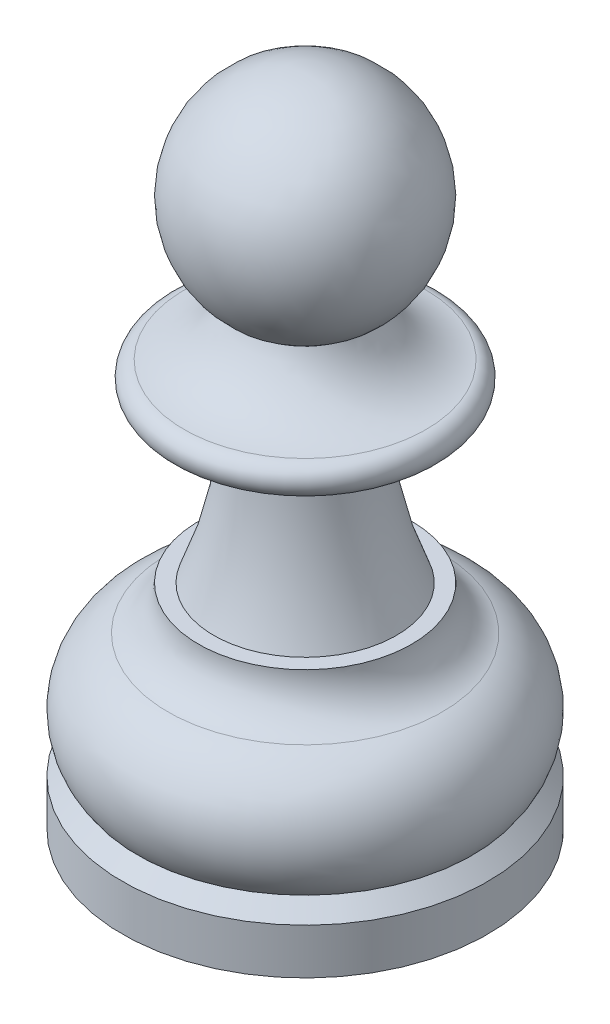
ISO-10303-21;
HEADER;
FILE_DESCRIPTION(('STEP AP214'),'2;1');
FILE_NAME('part.step','',(''),(''),'','','');
FILE_SCHEMA(('AUTOMOTIVE_DESIGN { 1 0 10303 214 1 1 1 1 }'));
ENDSEC;
DATA;
#1=APPLICATION_CONTEXT('core data for automotive mechanical design processes');
#2=APPLICATION_PROTOCOL_DEFINITION('international standard','automotive_design',2000,#1);
#3=PRODUCT_CONTEXT('',#1,'mechanical');
#4=PRODUCT('Part','Part','',(#3));
#5=PRODUCT_RELATED_PRODUCT_CATEGORY('part','',(#4));
#6=PRODUCT_DEFINITION_FORMATION('','',#4);
#7=PRODUCT_DEFINITION_CONTEXT('part definition',#1,'design');
#8=PRODUCT_DEFINITION('design','',#6,#7);
#9=PRODUCT_DEFINITION_SHAPE('','',#8);
#10=(LENGTH_UNIT() NAMED_UNIT(*) SI_UNIT(.MILLI.,.METRE.));
#11=(NAMED_UNIT(*) PLANE_ANGLE_UNIT() SI_UNIT($,.RADIAN.));
#12=(NAMED_UNIT(*) SI_UNIT($,.STERADIAN.) SOLID_ANGLE_UNIT());
#13=UNCERTAINTY_MEASURE_WITH_UNIT(LENGTH_MEASURE(1.E-05),#10,'distance_accuracy_value','');
#14=(GEOMETRIC_REPRESENTATION_CONTEXT(3) GLOBAL_UNCERTAINTY_ASSIGNED_CONTEXT((#13)) GLOBAL_UNIT_ASSIGNED_CONTEXT((#10,
#11,#12)) REPRESENTATION_CONTEXT('',''));
#15=CARTESIAN_POINT('',(0.,0.,0.));
#16=DIRECTION('',(0.,0.,1.));
#17=DIRECTION('',(1.,0.,0.));
#18=AXIS2_PLACEMENT_3D('',#15,#16,#17);
#19=CARTESIAN_POINT('',(0.,0.,0.));
#20=DIRECTION('',(0.,-1.,0.));
#21=DIRECTION('',(0.,0.,-1.));
#22=AXIS2_PLACEMENT_3D('',#19,#20,#21);
#23=PLANE('',#22);
#24=CARTESIAN_POINT('',(0.,0.,0.));
#25=DIRECTION('',(0.,-1.,0.));
#26=DIRECTION('',(0.,0.,-1.));
#27=AXIS2_PLACEMENT_3D('',#24,#25,#26);
#28=CIRCLE('',#27,12.);
#29=CARTESIAN_POINT('',(0.,0.,-12.));
#30=VERTEX_POINT('',#29);
#31=EDGE_CURVE('E10',#30,#30,#28,.T.);
#32=ORIENTED_EDGE('',*,*,#31,.T.);
#33=EDGE_LOOP('',(#32));
#34=FACE_BOUND('',#33,.T.);
#35=ADVANCED_FACE('F31',(#34),#23,.T.);
#36=CARTESIAN_POINT('',(0.,0.,0.));
#37=DIRECTION('',(0.,-1.,0.));
#38=DIRECTION('',(0.,0.,-1.));
#39=AXIS2_PLACEMENT_3D('',#36,#37,#38);
#40=CYLINDRICAL_SURFACE('',#39,12.);
#41=CARTESIAN_POINT('',(0.,3.,0.));
#42=DIRECTION('',(0.,-1.,0.));
#43=DIRECTION('',(0.,0.,-1.));
#44=AXIS2_PLACEMENT_3D('',#41,#42,#43);
#45=CIRCLE('',#44,12.);
#46=CARTESIAN_POINT('',(0.,3.,-12.));
#47=VERTEX_POINT('',#46);
#48=EDGE_CURVE('E37',#47,#47,#45,.T.);
#49=ORIENTED_EDGE('',*,*,#48,.T.);
#50=EDGE_LOOP('',(#49));
#51=FACE_BOUND('',#50,.T.);
#52=ORIENTED_EDGE('',*,*,#31,.F.);
#53=EDGE_LOOP('',(#52));
#54=FACE_BOUND('',#53,.T.);
#55=ADVANCED_FACE('F81',(#51,#54),#40,.T.);
#56=CARTESIAN_POINT('',(0.,3.,0.));
#57=DIRECTION('',(0.,-1.,0.));
#58=DIRECTION('',(0.,0.,-1.));
#59=AXIS2_PLACEMENT_3D('',#56,#57,#58);
#60=CONICAL_SURFACE('',#59,12.,0.785398163397456);
#61=CARTESIAN_POINT('',(0.,3.99999999999999,0.));
#62=DIRECTION('',(0.,-1.,0.));
#63=DIRECTION('',(0.,0.,-1.));
#64=AXIS2_PLACEMENT_3D('',#61,#62,#63);
#65=CIRCLE('',#64,11.);
#66=CARTESIAN_POINT('',(0.,3.99999999999999,-11.));
#67=VERTEX_POINT('',#66);
#68=EDGE_CURVE('E41',#67,#67,#65,.T.);
#69=ORIENTED_EDGE('',*,*,#68,.T.);
#70=EDGE_LOOP('',(#69));
#71=FACE_BOUND('',#70,.T.);
#72=ORIENTED_EDGE('',*,*,#48,.F.);
#73=EDGE_LOOP('',(#72));
#74=FACE_BOUND('',#73,.T.);
#75=ADVANCED_FACE('F85',(#71,#74),#60,.T.);
#76=CARTESIAN_POINT('',(0.,6.85164477067986,0.));
#77=DIRECTION('',(0.,-1.,0.));
#78=DIRECTION('',(0.,0.,-1.));
#79=AXIS2_PLACEMENT_3D('',#76,#77,#78);
#80=TOROIDAL_SURFACE('',#79,7.43406105092708,4.56593894907292);
#81=CARTESIAN_POINT('',(0.,11.1406579082719,0.));
#82=DIRECTION('',(0.,-1.,0.));
#83=DIRECTION('',(0.,0.,-1.));
#84=AXIS2_PLACEMENT_3D('',#81,#82,#83);
#85=CIRCLE('',#84,9.);
#86=CARTESIAN_POINT('',(0.,11.1406579082719,-9.));
#87=VERTEX_POINT('',#86);
#88=EDGE_CURVE('E45',#87,#87,#85,.T.);
#89=ORIENTED_EDGE('',*,*,#88,.T.);
#90=EDGE_LOOP('',(#89));
#91=FACE_BOUND('',#90,.T.);
#92=ORIENTED_EDGE('',*,*,#68,.F.);
#93=EDGE_LOOP('',(#92));
#94=FACE_BOUND('',#93,.T.);
#95=ADVANCED_FACE('F89',(#91,#94),#80,.T.);
#96=CARTESIAN_POINT('',(0.,14.,0.));
#97=DIRECTION('',(0.,-1.,0.));
#98=DIRECTION('',(0.,0.,-1.));
#99=AXIS2_PLACEMENT_3D('',#96,#97,#98);
#100=TOROIDAL_SURFACE('',#99,10.0439592993819,3.04395929938194);
#101=CARTESIAN_POINT('',(0.,14.,0.));
#102=DIRECTION('',(0.,-1.,0.));
#103=DIRECTION('',(0.,0.,-1.));
#104=AXIS2_PLACEMENT_3D('',#101,#102,#103);
#105=CIRCLE('',#104,7.);
#106=CARTESIAN_POINT('',(0.,14.,-7.));
#107=VERTEX_POINT('',#106);
#108=EDGE_CURVE('E50',#107,#107,#105,.T.);
#109=ORIENTED_EDGE('',*,*,#108,.T.);
#110=EDGE_LOOP('',(#109));
#111=FACE_BOUND('',#110,.T.);
#112=ORIENTED_EDGE('',*,*,#88,.F.);
#113=EDGE_LOOP('',(#112));
#114=FACE_BOUND('',#113,.T.);
#115=ADVANCED_FACE('F96',(#111,#114),#100,.F.);
#116=CARTESIAN_POINT('',(6.,14.,0.));
#117=DIRECTION('',(0.,1.,0.));
#118=DIRECTION('',(0.,0.,1.));
#119=AXIS2_PLACEMENT_3D('',#116,#117,#118);
#120=PLANE('',#119);
#121=CARTESIAN_POINT('',(0.,14.,0.));
#122=DIRECTION('',(0.,-1.,0.));
#123=DIRECTION('',(0.,0.,-1.));
#124=AXIS2_PLACEMENT_3D('',#121,#122,#123);
#125=CIRCLE('',#124,5.99999999999999);
#126=CARTESIAN_POINT('',(0.,14.,-5.99999999999999));
#127=VERTEX_POINT('',#126);
#128=EDGE_CURVE('E53',#127,#127,#125,.T.);
#129=ORIENTED_EDGE('',*,*,#128,.T.);
#130=EDGE_LOOP('',(#129));
#131=FACE_BOUND('',#130,.T.);
#132=ORIENTED_EDGE('',*,*,#108,.F.);
#133=EDGE_LOOP('',(#132));
#134=FACE_BOUND('',#133,.T.);
#135=ADVANCED_FACE('F100',(#131,#134),#120,.T.);
#136=CARTESIAN_POINT('',(0.,24.,0.));
#137=DIRECTION('',(0.,-1.,0.));
#138=DIRECTION('',(0.,0.,-1.));
#139=AXIS2_PLACEMENT_3D('',#136,#137,#138);
#140=TOROIDAL_SURFACE('',#139,30.,26.);
#141=CARTESIAN_POINT('',(0.,24.,0.));
#142=DIRECTION('',(0.,-1.,0.));
#143=DIRECTION('',(0.,0.,-1.));
#144=AXIS2_PLACEMENT_3D('',#141,#142,#143);
#145=CIRCLE('',#144,4.);
#146=CARTESIAN_POINT('',(0.,24.,-4.));
#147=VERTEX_POINT('',#146);
#148=EDGE_CURVE('E56',#147,#147,#145,.T.);
#149=ORIENTED_EDGE('',*,*,#148,.T.);
#150=EDGE_LOOP('',(#149));
#151=FACE_BOUND('',#150,.T.);
#152=ORIENTED_EDGE('',*,*,#128,.F.);
#153=EDGE_LOOP('',(#152));
#154=FACE_BOUND('',#153,.T.);
#155=ADVANCED_FACE('F104',(#151,#154),#140,.F.);
#156=CARTESIAN_POINT('',(0.,24.,0.));
#157=DIRECTION('',(0.,1.,0.));
#158=DIRECTION('',(0.,0.,1.));
#159=AXIS2_PLACEMENT_3D('',#156,#157,#158);
#160=CONICAL_SURFACE('',#159,4.,1.39626340159547);
#161=CARTESIAN_POINT('',(0.,24.7053079228338,0.));
#162=DIRECTION('',(0.,-1.,0.));
#163=DIRECTION('',(0.,0.,-1.));
#164=AXIS2_PLACEMENT_3D('',#161,#162,#163);
#165=CIRCLE('',#164,8.);
#166=CARTESIAN_POINT('',(0.,24.7053079228338,-8.));
#167=VERTEX_POINT('',#166);
#168=EDGE_CURVE('E59',#167,#167,#165,.T.);
#169=ORIENTED_EDGE('',*,*,#168,.T.);
#170=EDGE_LOOP('',(#169));
#171=FACE_BOUND('',#170,.T.);
#172=ORIENTED_EDGE('',*,*,#148,.F.);
#173=EDGE_LOOP('',(#172));
#174=FACE_BOUND('',#173,.T.);
#175=ADVANCED_FACE('F108',(#171,#174),#160,.T.);
#176=CARTESIAN_POINT('',(0.,25.690115675846,0.));
#177=DIRECTION('',(0.,-1.,0.));
#178=DIRECTION('',(0.,0.,-1.));
#179=AXIS2_PLACEMENT_3D('',#176,#177,#178);
#180=TOROIDAL_SURFACE('',#179,7.82635182233308,1.);
#181=CARTESIAN_POINT('',(0.,26.6832031350185,0.));
#182=DIRECTION('',(0.,-1.,0.));
#183=DIRECTION('',(0.,0.,-1.));
#184=AXIS2_PLACEMENT_3D('',#181,#182,#183);
#185=CIRCLE('',#184,7.94372855952706);
#186=CARTESIAN_POINT('',(0.,26.6832031350185,-7.94372855952706));
#187=VERTEX_POINT('',#186);
#188=EDGE_CURVE('E62',#187,#187,#185,.T.);
#189=ORIENTED_EDGE('',*,*,#188,.T.);
#190=EDGE_LOOP('',(#189));
#191=FACE_BOUND('',#190,.T.);
#192=ORIENTED_EDGE('',*,*,#168,.F.);
#193=EDGE_LOOP('',(#192));
#194=FACE_BOUND('',#193,.T.);
#195=ADVANCED_FACE('F78',(#191,#194),#180,.T.);
#196=CARTESIAN_POINT('',(0.,32.000674069009,0.));
#197=DIRECTION('',(0.,-1.,0.));
#198=DIRECTION('',(0.,0.,-1.));
#199=AXIS2_PLACEMENT_3D('',#196,#197,#198);
#200=TOROIDAL_SURFACE('',#199,8.57222042355254,5.3544840234125);
#201=CARTESIAN_POINT('',(0.,30.,0.));
#202=DIRECTION('',(0.,-1.,0.));
#203=DIRECTION('',(0.,0.,-1.));
#204=AXIS2_PLACEMENT_3D('',#201,#202,#203);
#205=CIRCLE('',#204,3.60555127546399);
#206=CARTESIAN_POINT('',(0.,30.,-3.60555127546399));
#207=VERTEX_POINT('',#206);
#208=EDGE_CURVE('E65',#207,#207,#205,.T.);
#209=ORIENTED_EDGE('',*,*,#208,.T.);
#210=EDGE_LOOP('',(#209));
#211=FACE_BOUND('',#210,.T.);
#212=ORIENTED_EDGE('',*,*,#188,.F.);
#213=EDGE_LOOP('',(#212));
#214=FACE_BOUND('',#213,.T.);
#215=ADVANCED_FACE('F69',(#211,#214),#200,.F.);
#216=CARTESIAN_POINT('',(0.,36.,0.));
#217=DIRECTION('',(0.,-1.,0.));
#218=DIRECTION('',(1.,0.,0.));
#219=AXIS2_PLACEMENT_3D('',#216,#217,#218);
#220=SPHERICAL_SURFACE('',#219,7.);
#221=ORIENTED_EDGE('',*,*,#208,.F.);
#222=EDGE_LOOP('',(#221));
#223=FACE_BOUND('',#222,.T.);
#224=ADVANCED_FACE('F72',(#223),#220,.T.);
#225=CLOSED_SHELL('',(#35,#55,#75,#95,#115,#135,#155,#175,#195,#215,#224));
#226=MANIFOLD_SOLID_BREP('B2',#225);
#227=ADVANCED_BREP_SHAPE_REPRESENTATION('',(#18,#226),#14);
#228=SHAPE_DEFINITION_REPRESENTATION(#9,#227);
ENDSEC;
END-ISO-10303-21;
